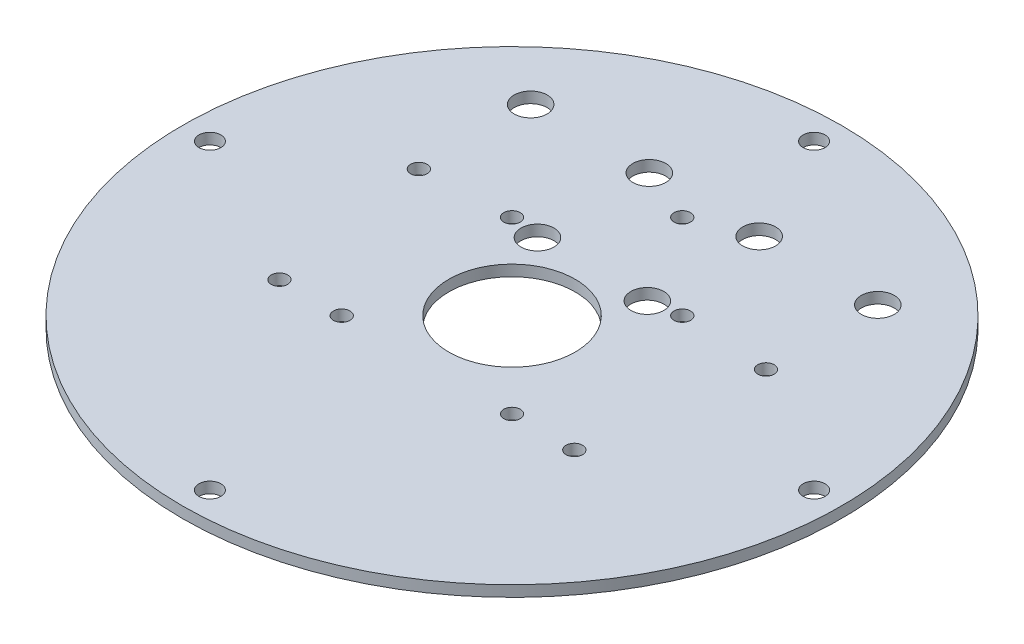
ISO-10303-21;
HEADER;
FILE_DESCRIPTION(('STEP AP214'),'2;1');
FILE_NAME('part.step','',(''),(''),'','','');
FILE_SCHEMA(('AUTOMOTIVE_DESIGN { 1 0 10303 214 1 1 1 1 }'));
ENDSEC;
DATA;
#1=APPLICATION_CONTEXT('core data for automotive mechanical design processes');
#2=APPLICATION_PROTOCOL_DEFINITION('international standard','automotive_design',2000,#1);
#3=PRODUCT_CONTEXT('',#1,'mechanical');
#4=PRODUCT('Part','Part','',(#3));
#5=PRODUCT_RELATED_PRODUCT_CATEGORY('part','',(#4));
#6=PRODUCT_DEFINITION_FORMATION('','',#4);
#7=PRODUCT_DEFINITION_CONTEXT('part definition',#1,'design');
#8=PRODUCT_DEFINITION('design','',#6,#7);
#9=PRODUCT_DEFINITION_SHAPE('','',#8);
#10=(LENGTH_UNIT() NAMED_UNIT(*) SI_UNIT(.MILLI.,.METRE.));
#11=(NAMED_UNIT(*) PLANE_ANGLE_UNIT() SI_UNIT($,.RADIAN.));
#12=(NAMED_UNIT(*) SI_UNIT($,.STERADIAN.) SOLID_ANGLE_UNIT());
#13=UNCERTAINTY_MEASURE_WITH_UNIT(LENGTH_MEASURE(1.E-05),#10,'distance_accuracy_value','');
#14=(GEOMETRIC_REPRESENTATION_CONTEXT(3) GLOBAL_UNCERTAINTY_ASSIGNED_CONTEXT((#13)) GLOBAL_UNIT_ASSIGNED_CONTEXT((#10,
#11,#12)) REPRESENTATION_CONTEXT('',''));
#15=CARTESIAN_POINT('',(0.,0.,0.));
#16=DIRECTION('',(0.,0.,1.));
#17=DIRECTION('',(1.,0.,0.));
#18=AXIS2_PLACEMENT_3D('',#15,#16,#17);
#19=CARTESIAN_POINT('',(0.,2.,0.));
#20=DIRECTION('',(0.,1.,0.));
#21=DIRECTION('',(0.,0.,1.));
#22=AXIS2_PLACEMENT_3D('',#19,#20,#21);
#23=PLANE('',#22);
#24=CARTESIAN_POINT('',(-31.6,2.,-14.64));
#25=DIRECTION('',(0.,1.,0.));
#26=DIRECTION('',(0.,0.,1.));
#27=AXIS2_PLACEMENT_3D('',#24,#25,#26);
#28=CIRCLE('',#27,1.5);
#29=CARTESIAN_POINT('',(-31.6,2.,-13.14));
#30=VERTEX_POINT('',#29);
#31=EDGE_CURVE('E191',#30,#30,#28,.T.);
#32=ORIENTED_EDGE('',*,*,#31,.F.);
#33=EDGE_LOOP('',(#32));
#34=FACE_BOUND('',#33,.T.);
#35=CARTESIAN_POINT('',(31.6,2.,-14.64));
#36=DIRECTION('',(0.,1.,0.));
#37=DIRECTION('',(0.,0.,1.));
#38=AXIS2_PLACEMENT_3D('',#35,#36,#37);
#39=CIRCLE('',#38,1.5);
#40=CARTESIAN_POINT('',(31.6,2.,-13.14));
#41=VERTEX_POINT('',#40);
#42=EDGE_CURVE('E198',#41,#41,#39,.T.);
#43=ORIENTED_EDGE('',*,*,#42,.F.);
#44=EDGE_LOOP('',(#43));
#45=FACE_BOUND('',#44,.T.);
#46=CARTESIAN_POINT('',(31.6,2.,-35.));
#47=DIRECTION('',(0.,1.,0.));
#48=DIRECTION('',(0.,0.,1.));
#49=AXIS2_PLACEMENT_3D('',#46,#47,#48);
#50=CIRCLE('',#49,2.99999999999999);
#51=CARTESIAN_POINT('',(31.6,2.,-32.));
#52=VERTEX_POINT('',#51);
#53=EDGE_CURVE('E175',#52,#52,#50,.T.);
#54=ORIENTED_EDGE('',*,*,#53,.F.);
#55=EDGE_LOOP('',(#54));
#56=FACE_BOUND('',#55,.T.);
#57=CARTESIAN_POINT('',(-31.6,2.,-35.));
#58=DIRECTION('',(0.,1.,0.));
#59=DIRECTION('',(0.,0.,1.));
#60=AXIS2_PLACEMENT_3D('',#57,#58,#59);
#61=CIRCLE('',#60,3.);
#62=CARTESIAN_POINT('',(-31.6,2.,-32.));
#63=VERTEX_POINT('',#62);
#64=EDGE_CURVE('E182',#63,#63,#61,.T.);
#65=ORIENTED_EDGE('',*,*,#64,.F.);
#66=EDGE_LOOP('',(#65));
#67=FACE_BOUND('',#66,.T.);
#68=CARTESIAN_POINT('',(10.,2.,-35.));
#69=DIRECTION('',(0.,1.,0.));
#70=DIRECTION('',(0.,0.,1.));
#71=AXIS2_PLACEMENT_3D('',#68,#69,#70);
#72=CIRCLE('',#71,3.);
#73=CARTESIAN_POINT('',(10.,2.,-32.));
#74=VERTEX_POINT('',#73);
#75=EDGE_CURVE('E152',#74,#74,#72,.T.);
#76=ORIENTED_EDGE('',*,*,#75,.F.);
#77=EDGE_LOOP('',(#76));
#78=FACE_BOUND('',#77,.T.);
#79=CARTESIAN_POINT('',(-10.,2.,-35.));
#80=DIRECTION('',(0.,1.,0.));
#81=DIRECTION('',(0.,0.,1.));
#82=AXIS2_PLACEMENT_3D('',#79,#80,#81);
#83=CIRCLE('',#82,3.);
#84=CARTESIAN_POINT('',(-10.,2.,-32.));
#85=VERTEX_POINT('',#84);
#86=EDGE_CURVE('E166',#85,#85,#83,.T.);
#87=ORIENTED_EDGE('',*,*,#86,.F.);
#88=EDGE_LOOP('',(#87));
#89=FACE_BOUND('',#88,.T.);
#90=CARTESIAN_POINT('',(0.,2.,55.));
#91=DIRECTION('',(0.,1.,0.));
#92=DIRECTION('',(0.,0.,1.));
#93=AXIS2_PLACEMENT_3D('',#90,#91,#92);
#94=CIRCLE('',#93,2.);
#95=CARTESIAN_POINT('',(0.,2.,57.));
#96=VERTEX_POINT('',#95);
#97=EDGE_CURVE('E127',#96,#96,#94,.T.);
#98=ORIENTED_EDGE('',*,*,#97,.F.);
#99=EDGE_LOOP('',(#98));
#100=FACE_BOUND('',#99,.T.);
#101=CARTESIAN_POINT('',(55.0000000000016,2.,1.55309068257925E-12));
#102=DIRECTION('',(0.,1.,0.));
#103=DIRECTION('',(0.,0.,1.));
#104=AXIS2_PLACEMENT_3D('',#101,#102,#103);
#105=CIRCLE('',#104,2.00000000000121);
#106=CARTESIAN_POINT('',(55.0000000000016,2.,2.00000000000277));
#107=VERTEX_POINT('',#106);
#108=EDGE_CURVE('E134',#107,#107,#105,.T.);
#109=ORIENTED_EDGE('',*,*,#108,.F.);
#110=EDGE_LOOP('',(#109));
#111=FACE_BOUND('',#110,.T.);
#112=CARTESIAN_POINT('',(3.10618136515851E-12,2.,-55.));
#113=DIRECTION('',(0.,1.,0.));
#114=DIRECTION('',(0.,0.,1.));
#115=AXIS2_PLACEMENT_3D('',#112,#113,#114);
#116=CIRCLE('',#115,2.00000000000334);
#117=CARTESIAN_POINT('',(3.10618136515851E-12,2.,-52.9999999999967));
#118=VERTEX_POINT('',#117);
#119=EDGE_CURVE('E138',#118,#118,#116,.T.);
#120=ORIENTED_EDGE('',*,*,#119,.F.);
#121=EDGE_LOOP('',(#120));
#122=FACE_BOUND('',#121,.T.);
#123=CARTESIAN_POINT('',(-54.9999999999985,2.,-1.55982623997457E-12));
#124=DIRECTION('',(0.,1.,0.));
#125=DIRECTION('',(0.,0.,1.));
#126=AXIS2_PLACEMENT_3D('',#123,#124,#125);
#127=CIRCLE('',#126,2.0000000000025);
#128=CARTESIAN_POINT('',(-54.9999999999985,2.,2.00000000000094));
#129=VERTEX_POINT('',#128);
#130=EDGE_CURVE('E142',#129,#129,#127,.T.);
#131=ORIENTED_EDGE('',*,*,#130,.F.);
#132=EDGE_LOOP('',(#131));
#133=FACE_BOUND('',#132,.T.);
#134=CARTESIAN_POINT('',(10.,2.,-14.64));
#135=DIRECTION('',(0.,1.,0.));
#136=DIRECTION('',(0.,0.,1.));
#137=AXIS2_PLACEMENT_3D('',#134,#135,#136);
#138=CIRCLE('',#137,3.);
#139=CARTESIAN_POINT('',(10.,2.,-11.64));
#140=VERTEX_POINT('',#139);
#141=EDGE_CURVE('E96',#140,#140,#138,.T.);
#142=ORIENTED_EDGE('',*,*,#141,.F.);
#143=EDGE_LOOP('',(#142));
#144=FACE_BOUND('',#143,.T.);
#145=CARTESIAN_POINT('',(-10.,2.,-14.64));
#146=DIRECTION('',(0.,1.,0.));
#147=DIRECTION('',(0.,0.,1.));
#148=AXIS2_PLACEMENT_3D('',#145,#146,#147);
#149=CIRCLE('',#148,3.);
#150=CARTESIAN_POINT('',(-10.,2.,-11.64));
#151=VERTEX_POINT('',#150);
#152=EDGE_CURVE('E118',#151,#151,#149,.T.);
#153=ORIENTED_EDGE('',*,*,#152,.F.);
#154=EDGE_LOOP('',(#153));
#155=FACE_BOUND('',#154,.T.);
#156=CARTESIAN_POINT('',(-15.4999999999991,2.,15.5));
#157=DIRECTION('',(0.,1.,0.));
#158=DIRECTION('',(0.,0.,1.));
#159=AXIS2_PLACEMENT_3D('',#156,#157,#158);
#160=CIRCLE('',#159,1.50000000000046);
#161=CARTESIAN_POINT('',(-15.4999999999991,2.,17.0000000000005));
#162=VERTEX_POINT('',#161);
#163=EDGE_CURVE('E91',#162,#162,#160,.T.);
#164=ORIENTED_EDGE('',*,*,#163,.F.);
#165=EDGE_LOOP('',(#164));
#166=FACE_BOUND('',#165,.T.);
#167=CARTESIAN_POINT('',(15.5000000000009,2.,15.4999999999991));
#168=DIRECTION('',(0.,1.,0.));
#169=DIRECTION('',(0.,0.,1.));
#170=AXIS2_PLACEMENT_3D('',#167,#168,#169);
#171=CIRCLE('',#170,1.50000000000123);
#172=CARTESIAN_POINT('',(15.5000000000009,2.,17.0000000000003));
#173=VERTEX_POINT('',#172);
#174=EDGE_CURVE('E100',#173,#173,#171,.T.);
#175=ORIENTED_EDGE('',*,*,#174,.F.);
#176=EDGE_LOOP('',(#175));
#177=FACE_BOUND('',#176,.T.);
#178=CARTESIAN_POINT('',(15.5,2.,-15.5000000000009));
#179=DIRECTION('',(0.,1.,0.));
#180=DIRECTION('',(0.,0.,1.));
#181=AXIS2_PLACEMENT_3D('',#178,#179,#180);
#182=CIRCLE('',#181,1.50000000000091);
#183=CARTESIAN_POINT('',(15.5,2.,-14.));
#184=VERTEX_POINT('',#183);
#185=EDGE_CURVE('E108',#184,#184,#182,.T.);
#186=ORIENTED_EDGE('',*,*,#185,.F.);
#187=EDGE_LOOP('',(#186));
#188=FACE_BOUND('',#187,.T.);
#189=CARTESIAN_POINT('',(-15.5,2.,-15.5));
#190=DIRECTION('',(0.,1.,0.));
#191=DIRECTION('',(0.,0.,1.));
#192=AXIS2_PLACEMENT_3D('',#189,#190,#191);
#193=CIRCLE('',#192,1.5);
#194=CARTESIAN_POINT('',(-15.5,2.,-14.));
#195=VERTEX_POINT('',#194);
#196=EDGE_CURVE('E83',#195,#195,#193,.T.);
#197=ORIENTED_EDGE('',*,*,#196,.F.);
#198=EDGE_LOOP('',(#197));
#199=FACE_BOUND('',#198,.T.);
#200=CARTESIAN_POINT('',(0.,2.,0.));
#201=DIRECTION('',(0.,1.,0.));
#202=DIRECTION('',(0.,0.,1.));
#203=AXIS2_PLACEMENT_3D('',#200,#201,#202);
#204=CIRCLE('',#203,11.5);
#205=CARTESIAN_POINT('',(0.,2.,11.5));
#206=VERTEX_POINT('',#205);
#207=EDGE_CURVE('E75',#206,#206,#204,.T.);
#208=ORIENTED_EDGE('',*,*,#207,.F.);
#209=EDGE_LOOP('',(#208));
#210=FACE_BOUND('',#209,.T.);
#211=CARTESIAN_POINT('',(0.,2.,-31.));
#212=DIRECTION('',(0.,1.,0.));
#213=DIRECTION('',(0.,0.,1.));
#214=AXIS2_PLACEMENT_3D('',#211,#212,#213);
#215=CIRCLE('',#214,1.5);
#216=CARTESIAN_POINT('',(0.,2.,-29.5));
#217=VERTEX_POINT('',#216);
#218=EDGE_CURVE('E55',#217,#217,#215,.T.);
#219=ORIENTED_EDGE('',*,*,#218,.F.);
#220=EDGE_LOOP('',(#219));
#221=FACE_BOUND('',#220,.T.);
#222=CARTESIAN_POINT('',(0.,2.,0.));
#223=DIRECTION('',(0.,1.,0.));
#224=DIRECTION('',(0.,0.,1.));
#225=AXIS2_PLACEMENT_3D('',#222,#223,#224);
#226=CIRCLE('',#225,60.);
#227=CARTESIAN_POINT('',(0.,2.,60.));
#228=VERTEX_POINT('',#227);
#229=EDGE_CURVE('E10',#228,#228,#226,.T.);
#230=ORIENTED_EDGE('',*,*,#229,.T.);
#231=EDGE_LOOP('',(#230));
#232=FACE_BOUND('',#231,.T.);
#233=CARTESIAN_POINT('',(26.8467875173196,2.,15.4999999999988));
#234=DIRECTION('',(0.,1.,0.));
#235=DIRECTION('',(0.,0.,1.));
#236=AXIS2_PLACEMENT_3D('',#233,#234,#235);
#237=CIRCLE('',#236,1.50000000000172);
#238=CARTESIAN_POINT('',(26.8467875173196,2.,17.0000000000006));
#239=VERTEX_POINT('',#238);
#240=EDGE_CURVE('E49',#239,#239,#237,.T.);
#241=ORIENTED_EDGE('',*,*,#240,.F.);
#242=EDGE_LOOP('',(#241));
#243=FACE_BOUND('',#242,.T.);
#244=CARTESIAN_POINT('',(-26.8467875173156,2.,15.5000000000012));
#245=DIRECTION('',(0.,1.,0.));
#246=DIRECTION('',(0.,0.,1.));
#247=AXIS2_PLACEMENT_3D('',#244,#245,#246);
#248=CIRCLE('',#247,1.50000000000251);
#249=CARTESIAN_POINT('',(-26.8467875173156,2.,17.0000000000037));
#250=VERTEX_POINT('',#249);
#251=EDGE_CURVE('E63',#250,#250,#248,.T.);
#252=ORIENTED_EDGE('',*,*,#251,.F.);
#253=EDGE_LOOP('',(#252));
#254=FACE_BOUND('',#253,.T.);
#255=ADVANCED_FACE('F36',(#34,#45,#56,#67,#78,#89,#100,#111,#122,#133,#144,#155,#166,#177,#188,
#199,#210,#221,#232,#243,#254),#23,.T.);
#256=CARTESIAN_POINT('',(0.,0.,0.));
#257=DIRECTION('',(0.,1.,0.));
#258=DIRECTION('',(0.,0.,1.));
#259=AXIS2_PLACEMENT_3D('',#256,#257,#258);
#260=PLANE('',#259);
#261=CARTESIAN_POINT('',(-31.6,0.,-14.64));
#262=DIRECTION('',(0.,-1.,0.));
#263=DIRECTION('',(0.,0.,-1.));
#264=AXIS2_PLACEMENT_3D('',#261,#262,#263);
#265=CIRCLE('',#264,1.5);
#266=CARTESIAN_POINT('',(-31.6,0.,-16.14));
#267=VERTEX_POINT('',#266);
#268=EDGE_CURVE('E202',#267,#267,#265,.T.);
#269=ORIENTED_EDGE('',*,*,#268,.F.);
#270=EDGE_LOOP('',(#269));
#271=FACE_BOUND('',#270,.T.);
#272=CARTESIAN_POINT('',(31.6,0.,-14.64));
#273=DIRECTION('',(0.,-1.,0.));
#274=DIRECTION('',(0.,0.,-1.));
#275=AXIS2_PLACEMENT_3D('',#272,#273,#274);
#276=CIRCLE('',#275,1.5);
#277=CARTESIAN_POINT('',(31.6,0.,-16.14));
#278=VERTEX_POINT('',#277);
#279=EDGE_CURVE('E203',#278,#278,#276,.T.);
#280=ORIENTED_EDGE('',*,*,#279,.F.);
#281=EDGE_LOOP('',(#280));
#282=FACE_BOUND('',#281,.T.);
#283=CARTESIAN_POINT('',(31.6,0.,-35.));
#284=DIRECTION('',(0.,-1.,0.));
#285=DIRECTION('',(0.,0.,-1.));
#286=AXIS2_PLACEMENT_3D('',#283,#284,#285);
#287=CIRCLE('',#286,2.99999999999999);
#288=CARTESIAN_POINT('',(31.6,0.,-38.));
#289=VERTEX_POINT('',#288);
#290=EDGE_CURVE('E186',#289,#289,#287,.T.);
#291=ORIENTED_EDGE('',*,*,#290,.F.);
#292=EDGE_LOOP('',(#291));
#293=FACE_BOUND('',#292,.T.);
#294=CARTESIAN_POINT('',(-31.6,0.,-35.));
#295=DIRECTION('',(0.,-1.,0.));
#296=DIRECTION('',(0.,0.,-1.));
#297=AXIS2_PLACEMENT_3D('',#294,#295,#296);
#298=CIRCLE('',#297,3.);
#299=CARTESIAN_POINT('',(-31.6,0.,-38.));
#300=VERTEX_POINT('',#299);
#301=EDGE_CURVE('E187',#300,#300,#298,.T.);
#302=ORIENTED_EDGE('',*,*,#301,.F.);
#303=EDGE_LOOP('',(#302));
#304=FACE_BOUND('',#303,.T.);
#305=CARTESIAN_POINT('',(10.,0.,-35.));
#306=DIRECTION('',(0.,-1.,0.));
#307=DIRECTION('',(0.,0.,-1.));
#308=AXIS2_PLACEMENT_3D('',#305,#306,#307);
#309=CIRCLE('',#308,3.);
#310=CARTESIAN_POINT('',(10.,0.,-38.));
#311=VERTEX_POINT('',#310);
#312=EDGE_CURVE('E170',#311,#311,#309,.T.);
#313=ORIENTED_EDGE('',*,*,#312,.F.);
#314=EDGE_LOOP('',(#313));
#315=FACE_BOUND('',#314,.T.);
#316=CARTESIAN_POINT('',(-10.,0.,-35.));
#317=DIRECTION('',(0.,-1.,0.));
#318=DIRECTION('',(0.,0.,-1.));
#319=AXIS2_PLACEMENT_3D('',#316,#317,#318);
#320=CIRCLE('',#319,3.);
#321=CARTESIAN_POINT('',(-10.,0.,-38.));
#322=VERTEX_POINT('',#321);
#323=EDGE_CURVE('E171',#322,#322,#320,.T.);
#324=ORIENTED_EDGE('',*,*,#323,.F.);
#325=EDGE_LOOP('',(#324));
#326=FACE_BOUND('',#325,.T.);
#327=CARTESIAN_POINT('',(0.,0.,55.));
#328=DIRECTION('',(0.,-1.,0.));
#329=DIRECTION('',(0.,0.,-1.));
#330=AXIS2_PLACEMENT_3D('',#327,#328,#329);
#331=CIRCLE('',#330,2.);
#332=CARTESIAN_POINT('',(0.,0.,53.));
#333=VERTEX_POINT('',#332);
#334=EDGE_CURVE('E146',#333,#333,#331,.T.);
#335=ORIENTED_EDGE('',*,*,#334,.F.);
#336=EDGE_LOOP('',(#335));
#337=FACE_BOUND('',#336,.T.);
#338=CARTESIAN_POINT('',(55.0000000000016,0.,1.55309068257925E-12));
#339=DIRECTION('',(0.,-1.,0.));
#340=DIRECTION('',(0.,0.,-1.));
#341=AXIS2_PLACEMENT_3D('',#338,#339,#340);
#342=CIRCLE('',#341,2.00000000000121);
#343=CARTESIAN_POINT('',(55.0000000000016,0.,-1.99999999999966));
#344=VERTEX_POINT('',#343);
#345=EDGE_CURVE('E156',#344,#344,#342,.T.);
#346=ORIENTED_EDGE('',*,*,#345,.F.);
#347=EDGE_LOOP('',(#346));
#348=FACE_BOUND('',#347,.T.);
#349=CARTESIAN_POINT('',(3.10618136515851E-12,0.,-55.));
#350=DIRECTION('',(0.,-1.,0.));
#351=DIRECTION('',(0.,0.,-1.));
#352=AXIS2_PLACEMENT_3D('',#349,#350,#351);
#353=CIRCLE('',#352,2.00000000000334);
#354=CARTESIAN_POINT('',(3.10618136515851E-12,0.,-57.0000000000033));
#355=VERTEX_POINT('',#354);
#356=EDGE_CURVE('E151',#355,#355,#353,.T.);
#357=ORIENTED_EDGE('',*,*,#356,.F.);
#358=EDGE_LOOP('',(#357));
#359=FACE_BOUND('',#358,.T.);
#360=CARTESIAN_POINT('',(-54.9999999999985,0.,-1.55982623997457E-12));
#361=DIRECTION('',(0.,-1.,0.));
#362=DIRECTION('',(0.,0.,-1.));
#363=AXIS2_PLACEMENT_3D('',#360,#361,#362);
#364=CIRCLE('',#363,2.0000000000025);
#365=CARTESIAN_POINT('',(-54.9999999999985,0.,-2.00000000000406));
#366=VERTEX_POINT('',#365);
#367=EDGE_CURVE('E147',#366,#366,#364,.T.);
#368=ORIENTED_EDGE('',*,*,#367,.F.);
#369=EDGE_LOOP('',(#368));
#370=FACE_BOUND('',#369,.T.);
#371=CARTESIAN_POINT('',(10.,0.,-14.64));
#372=DIRECTION('',(0.,-1.,0.));
#373=DIRECTION('',(0.,0.,-1.));
#374=AXIS2_PLACEMENT_3D('',#371,#372,#373);
#375=CIRCLE('',#374,3.);
#376=CARTESIAN_POINT('',(10.,0.,-17.64));
#377=VERTEX_POINT('',#376);
#378=EDGE_CURVE('E122',#377,#377,#375,.T.);
#379=ORIENTED_EDGE('',*,*,#378,.F.);
#380=EDGE_LOOP('',(#379));
#381=FACE_BOUND('',#380,.T.);
#382=CARTESIAN_POINT('',(-10.,0.,-14.64));
#383=DIRECTION('',(0.,-1.,0.));
#384=DIRECTION('',(0.,0.,-1.));
#385=AXIS2_PLACEMENT_3D('',#382,#383,#384);
#386=CIRCLE('',#385,3.);
#387=CARTESIAN_POINT('',(-10.,0.,-17.64));
#388=VERTEX_POINT('',#387);
#389=EDGE_CURVE('E123',#388,#388,#386,.T.);
#390=ORIENTED_EDGE('',*,*,#389,.F.);
#391=EDGE_LOOP('',(#390));
#392=FACE_BOUND('',#391,.T.);
#393=CARTESIAN_POINT('',(-15.4999999999991,0.,15.5));
#394=DIRECTION('',(0.,1.,0.));
#395=DIRECTION('',(0.,0.,1.));
#396=AXIS2_PLACEMENT_3D('',#393,#394,#395);
#397=CIRCLE('',#396,1.50000000000046);
#398=CARTESIAN_POINT('',(-15.4999999999991,0.,17.0000000000005));
#399=VERTEX_POINT('',#398);
#400=EDGE_CURVE('E95',#399,#399,#397,.T.);
#401=ORIENTED_EDGE('',*,*,#400,.T.);
#402=EDGE_LOOP('',(#401));
#403=FACE_BOUND('',#402,.T.);
#404=CARTESIAN_POINT('',(15.5000000000009,0.,15.4999999999991));
#405=DIRECTION('',(0.,1.,0.));
#406=DIRECTION('',(0.,0.,1.));
#407=AXIS2_PLACEMENT_3D('',#404,#405,#406);
#408=CIRCLE('',#407,1.50000000000123);
#409=CARTESIAN_POINT('',(15.5000000000009,0.,17.0000000000003));
#410=VERTEX_POINT('',#409);
#411=EDGE_CURVE('E104',#410,#410,#408,.T.);
#412=ORIENTED_EDGE('',*,*,#411,.T.);
#413=EDGE_LOOP('',(#412));
#414=FACE_BOUND('',#413,.T.);
#415=CARTESIAN_POINT('',(15.5,0.,-15.5000000000009));
#416=DIRECTION('',(0.,1.,0.));
#417=DIRECTION('',(0.,0.,1.));
#418=AXIS2_PLACEMENT_3D('',#415,#416,#417);
#419=CIRCLE('',#418,1.50000000000091);
#420=CARTESIAN_POINT('',(15.5,0.,-14.));
#421=VERTEX_POINT('',#420);
#422=EDGE_CURVE('E87',#421,#421,#419,.T.);
#423=ORIENTED_EDGE('',*,*,#422,.T.);
#424=EDGE_LOOP('',(#423));
#425=FACE_BOUND('',#424,.T.);
#426=CARTESIAN_POINT('',(-15.5,0.,-15.5));
#427=DIRECTION('',(0.,1.,0.));
#428=DIRECTION('',(0.,0.,1.));
#429=AXIS2_PLACEMENT_3D('',#426,#427,#428);
#430=CIRCLE('',#429,1.5);
#431=CARTESIAN_POINT('',(-15.5,0.,-14.));
#432=VERTEX_POINT('',#431);
#433=EDGE_CURVE('E79',#432,#432,#430,.T.);
#434=ORIENTED_EDGE('',*,*,#433,.T.);
#435=EDGE_LOOP('',(#434));
#436=FACE_BOUND('',#435,.T.);
#437=CARTESIAN_POINT('',(0.,0.,0.));
#438=DIRECTION('',(0.,1.,0.));
#439=DIRECTION('',(0.,0.,1.));
#440=AXIS2_PLACEMENT_3D('',#437,#438,#439);
#441=CIRCLE('',#440,11.5);
#442=CARTESIAN_POINT('',(0.,0.,11.5));
#443=VERTEX_POINT('',#442);
#444=EDGE_CURVE('E71',#443,#443,#441,.T.);
#445=ORIENTED_EDGE('',*,*,#444,.T.);
#446=EDGE_LOOP('',(#445));
#447=FACE_BOUND('',#446,.T.);
#448=CARTESIAN_POINT('',(0.,0.,0.));
#449=DIRECTION('',(0.,1.,0.));
#450=DIRECTION('',(0.,0.,1.));
#451=AXIS2_PLACEMENT_3D('',#448,#449,#450);
#452=CIRCLE('',#451,60.);
#453=CARTESIAN_POINT('',(0.,0.,60.));
#454=VERTEX_POINT('',#453);
#455=EDGE_CURVE('E40',#454,#454,#452,.T.);
#456=ORIENTED_EDGE('',*,*,#455,.F.);
#457=EDGE_LOOP('',(#456));
#458=FACE_BOUND('',#457,.T.);
#459=CARTESIAN_POINT('',(26.8467875173196,0.,15.4999999999988));
#460=DIRECTION('',(0.,1.,0.));
#461=DIRECTION('',(0.,0.,1.));
#462=AXIS2_PLACEMENT_3D('',#459,#460,#461);
#463=CIRCLE('',#462,1.50000000000172);
#464=CARTESIAN_POINT('',(26.8467875173196,0.,17.0000000000006));
#465=VERTEX_POINT('',#464);
#466=EDGE_CURVE('E51',#465,#465,#463,.T.);
#467=ORIENTED_EDGE('',*,*,#466,.T.);
#468=EDGE_LOOP('',(#467));
#469=FACE_BOUND('',#468,.T.);
#470=CARTESIAN_POINT('',(0.,0.,-31.));
#471=DIRECTION('',(0.,1.,0.));
#472=DIRECTION('',(0.,0.,1.));
#473=AXIS2_PLACEMENT_3D('',#470,#471,#472);
#474=CIRCLE('',#473,1.5);
#475=CARTESIAN_POINT('',(0.,0.,-29.5));
#476=VERTEX_POINT('',#475);
#477=EDGE_CURVE('E59',#476,#476,#474,.T.);
#478=ORIENTED_EDGE('',*,*,#477,.T.);
#479=EDGE_LOOP('',(#478));
#480=FACE_BOUND('',#479,.T.);
#481=CARTESIAN_POINT('',(-26.8467875173156,0.,15.5000000000012));
#482=DIRECTION('',(0.,1.,0.));
#483=DIRECTION('',(0.,0.,1.));
#484=AXIS2_PLACEMENT_3D('',#481,#482,#483);
#485=CIRCLE('',#484,1.50000000000251);
#486=CARTESIAN_POINT('',(-26.8467875173156,0.,17.0000000000037));
#487=VERTEX_POINT('',#486);
#488=EDGE_CURVE('E67',#487,#487,#485,.T.);
#489=ORIENTED_EDGE('',*,*,#488,.T.);
#490=EDGE_LOOP('',(#489));
#491=FACE_BOUND('',#490,.T.);
#492=ADVANCED_FACE('F213',(#271,#282,#293,#304,#315,#326,#337,#348,#359,#370,#381,#392,#403,
#414,#425,#436,#447,#458,#469,#480,#491),#260,.F.);
#493=CARTESIAN_POINT('',(0.,2.,0.));
#494=DIRECTION('',(0.,-1.,0.));
#495=DIRECTION('',(0.,0.,-1.));
#496=AXIS2_PLACEMENT_3D('',#493,#494,#495);
#497=CYLINDRICAL_SURFACE('',#496,60.);
#498=ORIENTED_EDGE('',*,*,#229,.F.);
#499=EDGE_LOOP('',(#498));
#500=FACE_BOUND('',#499,.T.);
#501=ORIENTED_EDGE('',*,*,#455,.T.);
#502=EDGE_LOOP('',(#501));
#503=FACE_BOUND('',#502,.T.);
#504=ADVANCED_FACE('F38',(#500,#503),#497,.T.);
#505=CARTESIAN_POINT('',(26.8467875173196,2.,15.4999999999988));
#506=DIRECTION('',(0.,-1.,0.));
#507=DIRECTION('',(0.,0.,-1.));
#508=AXIS2_PLACEMENT_3D('',#505,#506,#507);
#509=CYLINDRICAL_SURFACE('',#508,1.50000000000172);
#510=ORIENTED_EDGE('',*,*,#240,.T.);
#511=EDGE_LOOP('',(#510));
#512=FACE_BOUND('',#511,.T.);
#513=ORIENTED_EDGE('',*,*,#466,.F.);
#514=EDGE_LOOP('',(#513));
#515=FACE_BOUND('',#514,.T.);
#516=ADVANCED_FACE('F269',(#512,#515),#509,.F.);
#517=CARTESIAN_POINT('',(0.,2.,-31.));
#518=DIRECTION('',(0.,-1.,0.));
#519=DIRECTION('',(0.,0.,-1.));
#520=AXIS2_PLACEMENT_3D('',#517,#518,#519);
#521=CYLINDRICAL_SURFACE('',#520,1.5);
#522=ORIENTED_EDGE('',*,*,#218,.T.);
#523=EDGE_LOOP('',(#522));
#524=FACE_BOUND('',#523,.T.);
#525=ORIENTED_EDGE('',*,*,#477,.F.);
#526=EDGE_LOOP('',(#525));
#527=FACE_BOUND('',#526,.T.);
#528=ADVANCED_FACE('F259',(#524,#527),#521,.F.);
#529=CARTESIAN_POINT('',(-26.8467875173156,2.,15.5000000000012));
#530=DIRECTION('',(0.,-1.,0.));
#531=DIRECTION('',(0.,0.,-1.));
#532=AXIS2_PLACEMENT_3D('',#529,#530,#531);
#533=CYLINDRICAL_SURFACE('',#532,1.50000000000251);
#534=ORIENTED_EDGE('',*,*,#251,.T.);
#535=EDGE_LOOP('',(#534));
#536=FACE_BOUND('',#535,.T.);
#537=ORIENTED_EDGE('',*,*,#488,.F.);
#538=EDGE_LOOP('',(#537));
#539=FACE_BOUND('',#538,.T.);
#540=ADVANCED_FACE('F256',(#536,#539),#533,.F.);
#541=CARTESIAN_POINT('',(0.,0.,0.));
#542=DIRECTION('',(0.,1.,0.));
#543=DIRECTION('',(0.,0.,1.));
#544=AXIS2_PLACEMENT_3D('',#541,#542,#543);
#545=CYLINDRICAL_SURFACE('',#544,11.5);
#546=ORIENTED_EDGE('',*,*,#444,.F.);
#547=EDGE_LOOP('',(#546));
#548=FACE_BOUND('',#547,.T.);
#549=ORIENTED_EDGE('',*,*,#207,.T.);
#550=EDGE_LOOP('',(#549));
#551=FACE_BOUND('',#550,.T.);
#552=ADVANCED_FACE('F258',(#548,#551),#545,.F.);
#553=CARTESIAN_POINT('',(-15.5,0.,-15.5));
#554=DIRECTION('',(0.,1.,0.));
#555=DIRECTION('',(0.,0.,1.));
#556=AXIS2_PLACEMENT_3D('',#553,#554,#555);
#557=CYLINDRICAL_SURFACE('',#556,1.5);
#558=ORIENTED_EDGE('',*,*,#433,.F.);
#559=EDGE_LOOP('',(#558));
#560=FACE_BOUND('',#559,.T.);
#561=ORIENTED_EDGE('',*,*,#196,.T.);
#562=EDGE_LOOP('',(#561));
#563=FACE_BOUND('',#562,.T.);
#564=ADVANCED_FACE('F266',(#560,#563),#557,.F.);
#565=CARTESIAN_POINT('',(15.5,0.,-15.5000000000009));
#566=DIRECTION('',(0.,1.,0.));
#567=DIRECTION('',(0.,0.,1.));
#568=AXIS2_PLACEMENT_3D('',#565,#566,#567);
#569=CYLINDRICAL_SURFACE('',#568,1.50000000000091);
#570=ORIENTED_EDGE('',*,*,#422,.F.);
#571=EDGE_LOOP('',(#570));
#572=FACE_BOUND('',#571,.T.);
#573=ORIENTED_EDGE('',*,*,#185,.T.);
#574=EDGE_LOOP('',(#573));
#575=FACE_BOUND('',#574,.T.);
#576=ADVANCED_FACE('F369',(#572,#575),#569,.F.);
#577=CARTESIAN_POINT('',(15.5000000000009,0.,15.4999999999991));
#578=DIRECTION('',(0.,1.,0.));
#579=DIRECTION('',(0.,0.,1.));
#580=AXIS2_PLACEMENT_3D('',#577,#578,#579);
#581=CYLINDRICAL_SURFACE('',#580,1.50000000000123);
#582=ORIENTED_EDGE('',*,*,#411,.F.);
#583=EDGE_LOOP('',(#582));
#584=FACE_BOUND('',#583,.T.);
#585=ORIENTED_EDGE('',*,*,#174,.T.);
#586=EDGE_LOOP('',(#585));
#587=FACE_BOUND('',#586,.T.);
#588=ADVANCED_FACE('F372',(#584,#587),#581,.F.);
#589=CARTESIAN_POINT('',(-15.4999999999991,0.,15.5));
#590=DIRECTION('',(0.,1.,0.));
#591=DIRECTION('',(0.,0.,1.));
#592=AXIS2_PLACEMENT_3D('',#589,#590,#591);
#593=CYLINDRICAL_SURFACE('',#592,1.50000000000046);
#594=ORIENTED_EDGE('',*,*,#400,.F.);
#595=EDGE_LOOP('',(#594));
#596=FACE_BOUND('',#595,.T.);
#597=ORIENTED_EDGE('',*,*,#163,.T.);
#598=EDGE_LOOP('',(#597));
#599=FACE_BOUND('',#598,.T.);
#600=ADVANCED_FACE('F367',(#596,#599),#593,.F.);
#601=CARTESIAN_POINT('',(-10.,10.,-14.64));
#602=DIRECTION('',(0.,-1.,0.));
#603=DIRECTION('',(0.,0.,-1.));
#604=AXIS2_PLACEMENT_3D('',#601,#602,#603);
#605=CYLINDRICAL_SURFACE('',#604,3.);
#606=ORIENTED_EDGE('',*,*,#152,.T.);
#607=EDGE_LOOP('',(#606));
#608=FACE_BOUND('',#607,.T.);
#609=ORIENTED_EDGE('',*,*,#389,.T.);
#610=EDGE_LOOP('',(#609));
#611=FACE_BOUND('',#610,.T.);
#612=ADVANCED_FACE('F363',(#608,#611),#605,.F.);
#613=CARTESIAN_POINT('',(10.,10.,-14.64));
#614=DIRECTION('',(0.,-1.,0.));
#615=DIRECTION('',(0.,0.,-1.));
#616=AXIS2_PLACEMENT_3D('',#613,#614,#615);
#617=CYLINDRICAL_SURFACE('',#616,3.);
#618=ORIENTED_EDGE('',*,*,#141,.T.);
#619=EDGE_LOOP('',(#618));
#620=FACE_BOUND('',#619,.T.);
#621=ORIENTED_EDGE('',*,*,#378,.T.);
#622=EDGE_LOOP('',(#621));
#623=FACE_BOUND('',#622,.T.);
#624=ADVANCED_FACE('F359',(#620,#623),#617,.F.);
#625=CARTESIAN_POINT('',(-54.9999999999985,10.,-1.55982623997457E-12));
#626=DIRECTION('',(0.,-1.,0.));
#627=DIRECTION('',(0.,0.,-1.));
#628=AXIS2_PLACEMENT_3D('',#625,#626,#627);
#629=CYLINDRICAL_SURFACE('',#628,2.0000000000025);
#630=ORIENTED_EDGE('',*,*,#130,.T.);
#631=EDGE_LOOP('',(#630));
#632=FACE_BOUND('',#631,.T.);
#633=ORIENTED_EDGE('',*,*,#367,.T.);
#634=EDGE_LOOP('',(#633));
#635=FACE_BOUND('',#634,.T.);
#636=ADVANCED_FACE('F355',(#632,#635),#629,.F.);
#637=CARTESIAN_POINT('',(3.10618136515851E-12,10.,-55.));
#638=DIRECTION('',(0.,-1.,0.));
#639=DIRECTION('',(0.,0.,-1.));
#640=AXIS2_PLACEMENT_3D('',#637,#638,#639);
#641=CYLINDRICAL_SURFACE('',#640,2.00000000000334);
#642=ORIENTED_EDGE('',*,*,#119,.T.);
#643=EDGE_LOOP('',(#642));
#644=FACE_BOUND('',#643,.T.);
#645=ORIENTED_EDGE('',*,*,#356,.T.);
#646=EDGE_LOOP('',(#645));
#647=FACE_BOUND('',#646,.T.);
#648=ADVANCED_FACE('F351',(#644,#647),#641,.F.);
#649=CARTESIAN_POINT('',(55.0000000000016,10.,1.55309068257925E-12));
#650=DIRECTION('',(0.,-1.,0.));
#651=DIRECTION('',(0.,0.,-1.));
#652=AXIS2_PLACEMENT_3D('',#649,#650,#651);
#653=CYLINDRICAL_SURFACE('',#652,2.00000000000121);
#654=ORIENTED_EDGE('',*,*,#108,.T.);
#655=EDGE_LOOP('',(#654));
#656=FACE_BOUND('',#655,.T.);
#657=ORIENTED_EDGE('',*,*,#345,.T.);
#658=EDGE_LOOP('',(#657));
#659=FACE_BOUND('',#658,.T.);
#660=ADVANCED_FACE('F347',(#656,#659),#653,.F.);
#661=CARTESIAN_POINT('',(0.,10.,55.));
#662=DIRECTION('',(0.,-1.,0.));
#663=DIRECTION('',(0.,0.,-1.));
#664=AXIS2_PLACEMENT_3D('',#661,#662,#663);
#665=CYLINDRICAL_SURFACE('',#664,2.);
#666=ORIENTED_EDGE('',*,*,#97,.T.);
#667=EDGE_LOOP('',(#666));
#668=FACE_BOUND('',#667,.T.);
#669=ORIENTED_EDGE('',*,*,#334,.T.);
#670=EDGE_LOOP('',(#669));
#671=FACE_BOUND('',#670,.T.);
#672=ADVANCED_FACE('F343',(#668,#671),#665,.F.);
#673=CARTESIAN_POINT('',(-10.,10.,-35.));
#674=DIRECTION('',(0.,-1.,0.));
#675=DIRECTION('',(0.,0.,-1.));
#676=AXIS2_PLACEMENT_3D('',#673,#674,#675);
#677=CYLINDRICAL_SURFACE('',#676,3.);
#678=ORIENTED_EDGE('',*,*,#86,.T.);
#679=EDGE_LOOP('',(#678));
#680=FACE_BOUND('',#679,.T.);
#681=ORIENTED_EDGE('',*,*,#323,.T.);
#682=EDGE_LOOP('',(#681));
#683=FACE_BOUND('',#682,.T.);
#684=ADVANCED_FACE('F339',(#680,#683),#677,.F.);
#685=CARTESIAN_POINT('',(10.,10.,-35.));
#686=DIRECTION('',(0.,-1.,0.));
#687=DIRECTION('',(0.,0.,-1.));
#688=AXIS2_PLACEMENT_3D('',#685,#686,#687);
#689=CYLINDRICAL_SURFACE('',#688,3.);
#690=ORIENTED_EDGE('',*,*,#75,.T.);
#691=EDGE_LOOP('',(#690));
#692=FACE_BOUND('',#691,.T.);
#693=ORIENTED_EDGE('',*,*,#312,.T.);
#694=EDGE_LOOP('',(#693));
#695=FACE_BOUND('',#694,.T.);
#696=ADVANCED_FACE('F335',(#692,#695),#689,.F.);
#697=CARTESIAN_POINT('',(-31.6,10.,-35.));
#698=DIRECTION('',(0.,-1.,0.));
#699=DIRECTION('',(0.,0.,-1.));
#700=AXIS2_PLACEMENT_3D('',#697,#698,#699);
#701=CYLINDRICAL_SURFACE('',#700,3.);
#702=ORIENTED_EDGE('',*,*,#64,.T.);
#703=EDGE_LOOP('',(#702));
#704=FACE_BOUND('',#703,.T.);
#705=ORIENTED_EDGE('',*,*,#301,.T.);
#706=EDGE_LOOP('',(#705));
#707=FACE_BOUND('',#706,.T.);
#708=ADVANCED_FACE('F331',(#704,#707),#701,.F.);
#709=CARTESIAN_POINT('',(31.6,10.,-35.));
#710=DIRECTION('',(0.,-1.,0.));
#711=DIRECTION('',(0.,0.,-1.));
#712=AXIS2_PLACEMENT_3D('',#709,#710,#711);
#713=CYLINDRICAL_SURFACE('',#712,2.99999999999999);
#714=ORIENTED_EDGE('',*,*,#53,.T.);
#715=EDGE_LOOP('',(#714));
#716=FACE_BOUND('',#715,.T.);
#717=ORIENTED_EDGE('',*,*,#290,.T.);
#718=EDGE_LOOP('',(#717));
#719=FACE_BOUND('',#718,.T.);
#720=ADVANCED_FACE('F313',(#716,#719),#713,.F.);
#721=CARTESIAN_POINT('',(31.6,10.,-14.64));
#722=DIRECTION('',(0.,-1.,0.));
#723=DIRECTION('',(0.,0.,-1.));
#724=AXIS2_PLACEMENT_3D('',#721,#722,#723);
#725=CYLINDRICAL_SURFACE('',#724,1.5);
#726=ORIENTED_EDGE('',*,*,#42,.T.);
#727=EDGE_LOOP('',(#726));
#728=FACE_BOUND('',#727,.T.);
#729=ORIENTED_EDGE('',*,*,#279,.T.);
#730=EDGE_LOOP('',(#729));
#731=FACE_BOUND('',#730,.T.);
#732=ADVANCED_FACE('F308',(#728,#731),#725,.F.);
#733=CARTESIAN_POINT('',(-31.6,10.,-14.64));
#734=DIRECTION('',(0.,-1.,0.));
#735=DIRECTION('',(0.,0.,-1.));
#736=AXIS2_PLACEMENT_3D('',#733,#734,#735);
#737=CYLINDRICAL_SURFACE('',#736,1.5);
#738=ORIENTED_EDGE('',*,*,#31,.T.);
#739=EDGE_LOOP('',(#738));
#740=FACE_BOUND('',#739,.T.);
#741=ORIENTED_EDGE('',*,*,#268,.T.);
#742=EDGE_LOOP('',(#741));
#743=FACE_BOUND('',#742,.T.);
#744=ADVANCED_FACE('F211',(#740,#743),#737,.F.);
#745=CLOSED_SHELL('',(#255,#492,#504,#516,#528,#540,#552,#564,#576,#588,#600,#612,#624,#636,
#648,#660,#672,#684,#696,#708,#720,#732,#744));
#746=MANIFOLD_SOLID_BREP('B2',#745);
#747=ADVANCED_BREP_SHAPE_REPRESENTATION('',(#18,#746),#14);
#748=SHAPE_DEFINITION_REPRESENTATION(#9,#747);
ENDSEC;
END-ISO-10303-21;
